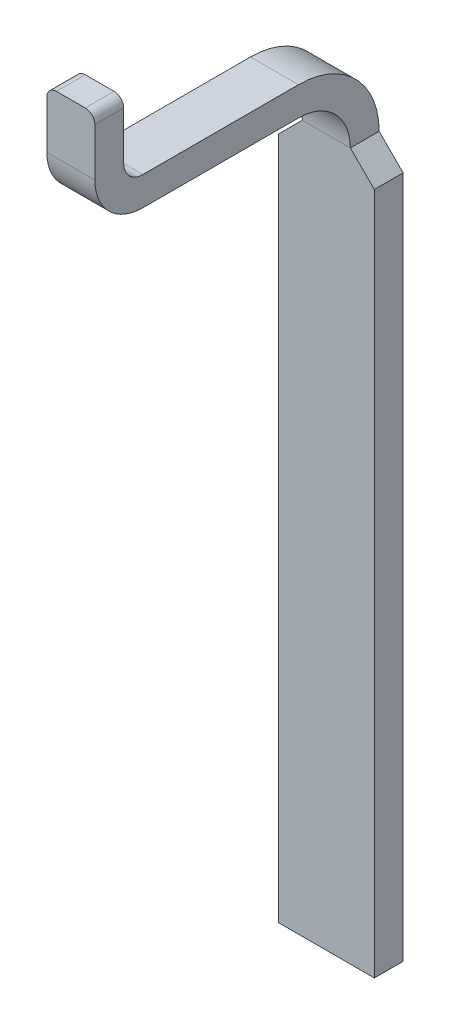
ISO-10303-21;
HEADER;
FILE_DESCRIPTION(('STEP AP214'),'2;1');
FILE_NAME('part.step','',(''),(''),'','','');
FILE_SCHEMA(('AUTOMOTIVE_DESIGN { 1 0 10303 214 1 1 1 1 }'));
ENDSEC;
DATA;
#1=APPLICATION_CONTEXT('core data for automotive mechanical design processes');
#2=APPLICATION_PROTOCOL_DEFINITION('international standard','automotive_design',2000,#1);
#3=PRODUCT_CONTEXT('',#1,'mechanical');
#4=PRODUCT('Part','Part','',(#3));
#5=PRODUCT_RELATED_PRODUCT_CATEGORY('part','',(#4));
#6=PRODUCT_DEFINITION_FORMATION('','',#4);
#7=PRODUCT_DEFINITION_CONTEXT('part definition',#1,'design');
#8=PRODUCT_DEFINITION('design','',#6,#7);
#9=PRODUCT_DEFINITION_SHAPE('','',#8);
#10=(LENGTH_UNIT() NAMED_UNIT(*) SI_UNIT(.MILLI.,.METRE.));
#11=(NAMED_UNIT(*) PLANE_ANGLE_UNIT() SI_UNIT($,.RADIAN.));
#12=(NAMED_UNIT(*) SI_UNIT($,.STERADIAN.) SOLID_ANGLE_UNIT());
#13=UNCERTAINTY_MEASURE_WITH_UNIT(LENGTH_MEASURE(1.E-05),#10,'distance_accuracy_value','');
#14=(GEOMETRIC_REPRESENTATION_CONTEXT(3) GLOBAL_UNCERTAINTY_ASSIGNED_CONTEXT((#13)) GLOBAL_UNIT_ASSIGNED_CONTEXT((#10,
#11,#12)) REPRESENTATION_CONTEXT('',''));
#15=CARTESIAN_POINT('',(0.,0.,0.));
#16=DIRECTION('',(0.,0.,1.));
#17=DIRECTION('',(1.,0.,0.));
#18=AXIS2_PLACEMENT_3D('',#15,#16,#17);
#19=CARTESIAN_POINT('',(0.075,2.61,1.405));
#20=DIRECTION('',(0.,0.,1.));
#21=DIRECTION('',(-1.,0.,0.));
#22=AXIS2_PLACEMENT_3D('',#19,#20,#21);
#23=CYLINDRICAL_SURFACE('',#22,0.05);
#24=CARTESIAN_POINT('',(0.075,2.61,1.405));
#25=DIRECTION('',(0.,0.,1.));
#26=DIRECTION('',(1.,0.,0.));
#27=AXIS2_PLACEMENT_3D('',#24,#25,#26);
#28=CIRCLE('',#27,0.05);
#29=CARTESIAN_POINT('',(0.125,2.61,1.405));
#30=VERTEX_POINT('',#29);
#31=CARTESIAN_POINT('',(0.075,2.66,1.405));
#32=VERTEX_POINT('',#31);
#33=EDGE_CURVE('E11',#30,#32,#28,.T.);
#34=ORIENTED_EDGE('',*,*,#33,.F.);
#35=DIRECTION('',(0.,0.,-1.));
#36=VECTOR('',#35,1.);
#37=CARTESIAN_POINT('',(0.125,2.61,0.345));
#38=LINE('',#37,#36);
#39=CARTESIAN_POINT('',(0.125,2.61,1.255));
#40=VERTEX_POINT('',#39);
#41=EDGE_CURVE('E23',#30,#40,#38,.T.);
#42=ORIENTED_EDGE('',*,*,#41,.T.);
#43=CARTESIAN_POINT('',(0.075,2.61,1.255));
#44=DIRECTION('',(0.,0.,-1.));
#45=DIRECTION('',(0.,1.,0.));
#46=AXIS2_PLACEMENT_3D('',#43,#44,#45);
#47=CIRCLE('',#46,0.05);
#48=CARTESIAN_POINT('',(0.075,2.66,1.255));
#49=VERTEX_POINT('',#48);
#50=EDGE_CURVE('E248',#49,#40,#47,.T.);
#51=ORIENTED_EDGE('',*,*,#50,.F.);
#52=DIRECTION('',(0.,0.,-1.));
#53=VECTOR('',#52,1.);
#54=CARTESIAN_POINT('',(0.075,2.66,1.405));
#55=LINE('',#54,#53);
#56=EDGE_CURVE('E245',#32,#49,#55,.T.);
#57=ORIENTED_EDGE('',*,*,#56,.F.);
#58=EDGE_LOOP('',(#34,#42,#51,#57));
#59=FACE_BOUND('',#58,.T.);
#60=ADVANCED_FACE('F16',(#59),#23,.T.);
#61=CARTESIAN_POINT('',(-0.075,2.61,0.345));
#62=DIRECTION('',(0.,0.,-1.));
#63=DIRECTION('',(1.,0.,0.));
#64=AXIS2_PLACEMENT_3D('',#61,#62,#63);
#65=CYLINDRICAL_SURFACE('',#64,0.05);
#66=CARTESIAN_POINT('',(-0.075,2.61,1.405));
#67=DIRECTION('',(0.,0.,1.));
#68=DIRECTION('',(1.,0.,0.));
#69=AXIS2_PLACEMENT_3D('',#66,#67,#68);
#70=CIRCLE('',#69,0.05);
#71=CARTESIAN_POINT('',(-0.075,2.66,1.405));
#72=VERTEX_POINT('',#71);
#73=CARTESIAN_POINT('',(-0.125,2.61,1.405));
#74=VERTEX_POINT('',#73);
#75=EDGE_CURVE('E243',#72,#74,#70,.T.);
#76=ORIENTED_EDGE('',*,*,#75,.F.);
#77=DIRECTION('',(0.,0.,-1.));
#78=VECTOR('',#77,1.);
#79=CARTESIAN_POINT('',(-0.075,2.66,1.405));
#80=LINE('',#79,#78);
#81=CARTESIAN_POINT('',(-0.075,2.66,1.255));
#82=VERTEX_POINT('',#81);
#83=EDGE_CURVE('E241',#72,#82,#80,.T.);
#84=ORIENTED_EDGE('',*,*,#83,.T.);
#85=CARTESIAN_POINT('',(-0.075,2.61,1.255));
#86=DIRECTION('',(0.,0.,-1.));
#87=DIRECTION('',(0.,1.,0.));
#88=AXIS2_PLACEMENT_3D('',#85,#86,#87);
#89=CIRCLE('',#88,0.05);
#90=CARTESIAN_POINT('',(-0.125,2.61,1.255));
#91=VERTEX_POINT('',#90);
#92=EDGE_CURVE('E238',#91,#82,#89,.T.);
#93=ORIENTED_EDGE('',*,*,#92,.F.);
#94=DIRECTION('',(0.,0.,-1.));
#95=VECTOR('',#94,1.);
#96=CARTESIAN_POINT('',(-0.125,2.61,1.255));
#97=LINE('',#96,#95);
#98=EDGE_CURVE('E235',#74,#91,#97,.T.);
#99=ORIENTED_EDGE('',*,*,#98,.F.);
#100=EDGE_LOOP('',(#76,#84,#93,#99));
#101=FACE_BOUND('',#100,.T.);
#102=ADVANCED_FACE('F275',(#101),#65,.T.);
#103=CARTESIAN_POINT('',(0.25,-1.84,0.075));
#104=DIRECTION('',(0.,1.,0.));
#105=DIRECTION('',(0.,0.,1.));
#106=AXIS2_PLACEMENT_3D('',#103,#104,#105);
#107=PLANE('',#106);
#108=DIRECTION('',(0.,0.,-1.));
#109=VECTOR('',#108,1.);
#110=CARTESIAN_POINT('',(-0.25,-1.84,0.075));
#111=LINE('',#110,#109);
#112=CARTESIAN_POINT('',(-0.25,-1.84,0.075));
#113=VERTEX_POINT('',#112);
#114=CARTESIAN_POINT('',(-0.25,-1.84,-0.075));
#115=VERTEX_POINT('',#114);
#116=EDGE_CURVE('E233',#113,#115,#111,.T.);
#117=ORIENTED_EDGE('',*,*,#116,.T.);
#118=DIRECTION('',(-1.,0.,0.));
#119=VECTOR('',#118,1.);
#120=CARTESIAN_POINT('',(0.25,-1.84,-0.075));
#121=LINE('',#120,#119);
#122=CARTESIAN_POINT('',(0.25,-1.84,-0.075));
#123=VERTEX_POINT('',#122);
#124=EDGE_CURVE('E230',#123,#115,#121,.T.);
#125=ORIENTED_EDGE('',*,*,#124,.F.);
#126=DIRECTION('',(0.,0.,-1.));
#127=VECTOR('',#126,1.);
#128=CARTESIAN_POINT('',(0.25,-1.84,0.075));
#129=LINE('',#128,#127);
#130=CARTESIAN_POINT('',(0.25,-1.84,0.075));
#131=VERTEX_POINT('',#130);
#132=EDGE_CURVE('E227',#131,#123,#129,.T.);
#133=ORIENTED_EDGE('',*,*,#132,.F.);
#134=DIRECTION('',(-1.,0.,0.));
#135=VECTOR('',#134,1.);
#136=CARTESIAN_POINT('',(0.25,-1.84,0.075));
#137=LINE('',#136,#135);
#138=EDGE_CURVE('E224',#131,#113,#137,.T.);
#139=ORIENTED_EDGE('',*,*,#138,.T.);
#140=EDGE_LOOP('',(#117,#125,#133,#139));
#141=FACE_BOUND('',#140,.T.);
#142=ADVANCED_FACE('F316',(#141),#107,.F.);
#143=CARTESIAN_POINT('',(0.25,-1.84,-0.075));
#144=DIRECTION('',(0.,0.,1.));
#145=DIRECTION('',(0.,-1.,0.));
#146=AXIS2_PLACEMENT_3D('',#143,#144,#145);
#147=PLANE('',#146);
#148=DIRECTION('',(0.,1.,0.));
#149=VECTOR('',#148,1.);
#150=CARTESIAN_POINT('',(-0.25,-1.84,-0.075));
#151=LINE('',#150,#149);
#152=CARTESIAN_POINT('',(-0.25,1.715,-0.075));
#153=VERTEX_POINT('',#152);
#154=EDGE_CURVE('E222',#115,#153,#151,.T.);
#155=ORIENTED_EDGE('',*,*,#154,.T.);
#156=DIRECTION('',(-0.707106781186547,-0.707106781186548,0.));
#157=VECTOR('',#156,1.);
#158=CARTESIAN_POINT('',(-0.125,1.84,-0.075));
#159=LINE('',#158,#157);
#160=CARTESIAN_POINT('',(-0.125,1.84,-0.075));
#161=VERTEX_POINT('',#160);
#162=EDGE_CURVE('E219',#161,#153,#159,.T.);
#163=ORIENTED_EDGE('',*,*,#162,.F.);
#164=DIRECTION('',(-1.,0.,0.));
#165=VECTOR('',#164,1.);
#166=CARTESIAN_POINT('',(0.25,1.84,-0.075));
#167=LINE('',#166,#165);
#168=CARTESIAN_POINT('',(0.125,1.84,-0.0749999999999992));
#169=VERTEX_POINT('',#168);
#170=EDGE_CURVE('E217',#169,#161,#167,.T.);
#171=ORIENTED_EDGE('',*,*,#170,.F.);
#172=DIRECTION('',(0.707106781186547,-0.707106781186548,0.));
#173=VECTOR('',#172,1.);
#174=CARTESIAN_POINT('',(0.25,1.715,-0.075));
#175=LINE('',#174,#173);
#176=CARTESIAN_POINT('',(0.25,1.715,-0.075));
#177=VERTEX_POINT('',#176);
#178=EDGE_CURVE('E215',#169,#177,#175,.T.);
#179=ORIENTED_EDGE('',*,*,#178,.T.);
#180=DIRECTION('',(0.,1.,0.));
#181=VECTOR('',#180,1.);
#182=CARTESIAN_POINT('',(0.25,-1.84,-0.075));
#183=LINE('',#182,#181);
#184=EDGE_CURVE('E212',#123,#177,#183,.T.);
#185=ORIENTED_EDGE('',*,*,#184,.F.);
#186=ORIENTED_EDGE('',*,*,#124,.T.);
#187=EDGE_LOOP('',(#155,#163,#171,#179,#185,#186));
#188=FACE_BOUND('',#187,.T.);
#189=ADVANCED_FACE('F308',(#188),#147,.F.);
#190=CARTESIAN_POINT('',(-0.125,1.84,-0.075));
#191=DIRECTION('',(0.707106781186548,-0.707106781186547,0.));
#192=DIRECTION('',(0.707106781186547,0.707106781186548,0.));
#193=AXIS2_PLACEMENT_3D('',#190,#191,#192);
#194=PLANE('',#193);
#195=ORIENTED_EDGE('',*,*,#162,.T.);
#196=DIRECTION('',(0.,0.,-1.));
#197=VECTOR('',#196,1.);
#198=CARTESIAN_POINT('',(-0.25,1.715,-0.075));
#199=LINE('',#198,#197);
#200=CARTESIAN_POINT('',(-0.25,1.715,0.075000000000001));
#201=VERTEX_POINT('',#200);
#202=EDGE_CURVE('E209',#201,#153,#199,.T.);
#203=ORIENTED_EDGE('',*,*,#202,.F.);
#204=DIRECTION('',(0.707106781186547,0.707106781186548,0.));
#205=VECTOR('',#204,1.);
#206=CARTESIAN_POINT('',(-0.125,1.84,0.075000000000001));
#207=LINE('',#206,#205);
#208=CARTESIAN_POINT('',(-0.125,1.84,0.075000000000001));
#209=VERTEX_POINT('',#208);
#210=EDGE_CURVE('E207',#201,#209,#207,.T.);
#211=ORIENTED_EDGE('',*,*,#210,.T.);
#212=DIRECTION('',(0.,0.,1.));
#213=VECTOR('',#212,1.);
#214=CARTESIAN_POINT('',(-0.125,1.84,-0.075));
#215=LINE('',#214,#213);
#216=EDGE_CURVE('E204',#161,#209,#215,.T.);
#217=ORIENTED_EDGE('',*,*,#216,.F.);
#218=EDGE_LOOP('',(#195,#203,#211,#217));
#219=FACE_BOUND('',#218,.T.);
#220=ADVANCED_FACE('F312',(#219),#194,.F.);
#221=CARTESIAN_POINT('',(0.25,1.715,-0.075));
#222=DIRECTION('',(0.707106781186548,0.707106781186547,0.));
#223=DIRECTION('',(-0.707106781186547,0.707106781186548,0.));
#224=AXIS2_PLACEMENT_3D('',#221,#222,#223);
#225=PLANE('',#224);
#226=ORIENTED_EDGE('',*,*,#178,.F.);
#227=DIRECTION('',(0.,0.,-1.));
#228=VECTOR('',#227,1.);
#229=CARTESIAN_POINT('',(0.125,1.84,-0.075));
#230=LINE('',#229,#228);
#231=CARTESIAN_POINT('',(0.125,1.84,0.075000000000001));
#232=VERTEX_POINT('',#231);
#233=EDGE_CURVE('E149',#232,#169,#230,.T.);
#234=ORIENTED_EDGE('',*,*,#233,.F.);
#235=DIRECTION('',(-0.707106781186547,0.707106781186548,0.));
#236=VECTOR('',#235,1.);
#237=CARTESIAN_POINT('',(0.25,1.715,0.075000000000001));
#238=LINE('',#237,#236);
#239=CARTESIAN_POINT('',(0.25,1.715,0.075000000000001));
#240=VERTEX_POINT('',#239);
#241=EDGE_CURVE('E200',#240,#232,#238,.T.);
#242=ORIENTED_EDGE('',*,*,#241,.F.);
#243=DIRECTION('',(0.,0.,1.));
#244=VECTOR('',#243,1.);
#245=CARTESIAN_POINT('',(0.25,1.715,0.075000000000001));
#246=LINE('',#245,#244);
#247=EDGE_CURVE('E197',#177,#240,#246,.T.);
#248=ORIENTED_EDGE('',*,*,#247,.F.);
#249=EDGE_LOOP('',(#226,#234,#242,#248));
#250=FACE_BOUND('',#249,.T.);
#251=ADVANCED_FACE('F303',(#250),#225,.T.);
#252=CARTESIAN_POINT('',(0.125,1.84,0.345));
#253=DIRECTION('',(1.,0.,0.));
#254=DIRECTION('',(0.,0.,1.));
#255=AXIS2_PLACEMENT_3D('',#252,#253,#254);
#256=CYLINDRICAL_SURFACE('',#255,0.27);
#257=CARTESIAN_POINT('',(-0.125,1.84,0.345));
#258=DIRECTION('',(1.,0.,0.));
#259=DIRECTION('',(0.,-1.,0.));
#260=AXIS2_PLACEMENT_3D('',#257,#258,#259);
#261=CIRCLE('',#260,0.27);
#262=CARTESIAN_POINT('',(-0.125,2.11,0.345));
#263=VERTEX_POINT('',#262);
#264=EDGE_CURVE('E194',#209,#263,#261,.T.);
#265=ORIENTED_EDGE('',*,*,#264,.F.);
#266=DIRECTION('',(-1.,0.,0.));
#267=VECTOR('',#266,1.);
#268=CARTESIAN_POINT('',(0.25,1.84,0.075000000000001));
#269=LINE('',#268,#267);
#270=EDGE_CURVE('E191',#232,#209,#269,.T.);
#271=ORIENTED_EDGE('',*,*,#270,.F.);
#272=CARTESIAN_POINT('',(0.125,1.84,0.345));
#273=DIRECTION('',(1.,0.,0.));
#274=DIRECTION('',(0.,-1.,0.));
#275=AXIS2_PLACEMENT_3D('',#272,#273,#274);
#276=CIRCLE('',#275,0.27);
#277=CARTESIAN_POINT('',(0.125,2.11,0.345));
#278=VERTEX_POINT('',#277);
#279=EDGE_CURVE('E188',#232,#278,#276,.T.);
#280=ORIENTED_EDGE('',*,*,#279,.T.);
#281=DIRECTION('',(-1.,0.,0.));
#282=VECTOR('',#281,1.);
#283=CARTESIAN_POINT('',(0.125,2.11,0.345));
#284=LINE('',#283,#282);
#285=EDGE_CURVE('E186',#278,#263,#284,.T.);
#286=ORIENTED_EDGE('',*,*,#285,.T.);
#287=EDGE_LOOP('',(#265,#271,#280,#286));
#288=FACE_BOUND('',#287,.T.);
#289=ADVANCED_FACE('F293',(#288),#256,.F.);
#290=CARTESIAN_POINT('',(-0.25,-1.84,-0.075));
#291=DIRECTION('',(1.,0.,0.));
#292=DIRECTION('',(0.,1.,0.));
#293=AXIS2_PLACEMENT_3D('',#290,#291,#292);
#294=PLANE('',#293);
#295=DIRECTION('',(0.,-1.,0.));
#296=VECTOR('',#295,1.);
#297=CARTESIAN_POINT('',(-0.25,1.84,0.075000000000001));
#298=LINE('',#297,#296);
#299=EDGE_CURVE('E183',#201,#113,#298,.T.);
#300=ORIENTED_EDGE('',*,*,#299,.F.);
#301=ORIENTED_EDGE('',*,*,#202,.T.);
#302=ORIENTED_EDGE('',*,*,#154,.F.);
#303=ORIENTED_EDGE('',*,*,#116,.F.);
#304=EDGE_LOOP('',(#300,#301,#302,#303));
#305=FACE_BOUND('',#304,.T.);
#306=ADVANCED_FACE('F314',(#305),#294,.F.);
#307=CARTESIAN_POINT('',(0.25,-1.84,-0.075));
#308=DIRECTION('',(1.,0.,0.));
#309=DIRECTION('',(0.,1.,0.));
#310=AXIS2_PLACEMENT_3D('',#307,#308,#309);
#311=PLANE('',#310);
#312=ORIENTED_EDGE('',*,*,#184,.T.);
#313=ORIENTED_EDGE('',*,*,#247,.T.);
#314=DIRECTION('',(0.,-1.,0.));
#315=VECTOR('',#314,1.);
#316=CARTESIAN_POINT('',(0.25,1.84,0.075000000000001));
#317=LINE('',#316,#315);
#318=EDGE_CURVE('E180',#240,#131,#317,.T.);
#319=ORIENTED_EDGE('',*,*,#318,.T.);
#320=ORIENTED_EDGE('',*,*,#132,.T.);
#321=EDGE_LOOP('',(#312,#313,#319,#320));
#322=FACE_BOUND('',#321,.T.);
#323=ADVANCED_FACE('F305',(#322),#311,.T.);
#324=CARTESIAN_POINT('',(0.25,1.84,0.075000000000001));
#325=DIRECTION('',(0.,0.,-1.));
#326=DIRECTION('',(0.,1.,0.));
#327=AXIS2_PLACEMENT_3D('',#324,#325,#326);
#328=PLANE('',#327);
#329=ORIENTED_EDGE('',*,*,#270,.T.);
#330=ORIENTED_EDGE('',*,*,#210,.F.);
#331=ORIENTED_EDGE('',*,*,#299,.T.);
#332=ORIENTED_EDGE('',*,*,#138,.F.);
#333=ORIENTED_EDGE('',*,*,#318,.F.);
#334=ORIENTED_EDGE('',*,*,#241,.T.);
#335=EDGE_LOOP('',(#329,#330,#331,#332,#333,#334));
#336=FACE_BOUND('',#335,.T.);
#337=ADVANCED_FACE('F296',(#336),#328,.F.);
#338=CARTESIAN_POINT('',(0.125,2.11,0.345));
#339=DIRECTION('',(0.,-1.,0.));
#340=DIRECTION('',(0.,0.,-1.));
#341=AXIS2_PLACEMENT_3D('',#338,#339,#340);
#342=PLANE('',#341);
#343=DIRECTION('',(0.,0.,1.));
#344=VECTOR('',#343,1.);
#345=CARTESIAN_POINT('',(-0.125,2.11,0.345));
#346=LINE('',#345,#344);
#347=CARTESIAN_POINT('',(-0.125,2.11,1.155));
#348=VERTEX_POINT('',#347);
#349=EDGE_CURVE('E178',#263,#348,#346,.T.);
#350=ORIENTED_EDGE('',*,*,#349,.F.);
#351=ORIENTED_EDGE('',*,*,#285,.F.);
#352=DIRECTION('',(0.,0.,1.));
#353=VECTOR('',#352,1.);
#354=CARTESIAN_POINT('',(0.125,2.11,0.345));
#355=LINE('',#354,#353);
#356=CARTESIAN_POINT('',(0.125,2.11,1.155));
#357=VERTEX_POINT('',#356);
#358=EDGE_CURVE('E176',#278,#357,#355,.T.);
#359=ORIENTED_EDGE('',*,*,#358,.T.);
#360=DIRECTION('',(-1.,0.,0.));
#361=VECTOR('',#360,1.);
#362=CARTESIAN_POINT('',(0.125,2.11,1.155));
#363=LINE('',#362,#361);
#364=EDGE_CURVE('E173',#357,#348,#363,.T.);
#365=ORIENTED_EDGE('',*,*,#364,.T.);
#366=EDGE_LOOP('',(#350,#351,#359,#365));
#367=FACE_BOUND('',#366,.T.);
#368=ADVANCED_FACE('F289',(#367),#342,.T.);
#369=CARTESIAN_POINT('',(0.125,2.36,1.155));
#370=DIRECTION('',(1.,0.,0.));
#371=DIRECTION('',(0.,0.,1.));
#372=AXIS2_PLACEMENT_3D('',#369,#370,#371);
#373=CYLINDRICAL_SURFACE('',#372,0.25);
#374=CARTESIAN_POINT('',(-0.125,2.36,1.155));
#375=DIRECTION('',(-1.,0.,0.));
#376=DIRECTION('',(0.,1.,0.));
#377=AXIS2_PLACEMENT_3D('',#374,#375,#376);
#378=CIRCLE('',#377,0.25);
#379=CARTESIAN_POINT('',(-0.125,2.36,1.405));
#380=VERTEX_POINT('',#379);
#381=EDGE_CURVE('E171',#348,#380,#378,.T.);
#382=ORIENTED_EDGE('',*,*,#381,.F.);
#383=ORIENTED_EDGE('',*,*,#364,.F.);
#384=CARTESIAN_POINT('',(0.125,2.36,1.155));
#385=DIRECTION('',(-1.,0.,0.));
#386=DIRECTION('',(0.,1.,0.));
#387=AXIS2_PLACEMENT_3D('',#384,#385,#386);
#388=CIRCLE('',#387,0.25);
#389=CARTESIAN_POINT('',(0.125,2.36,1.405));
#390=VERTEX_POINT('',#389);
#391=EDGE_CURVE('E169',#357,#390,#388,.T.);
#392=ORIENTED_EDGE('',*,*,#391,.T.);
#393=DIRECTION('',(-1.,0.,0.));
#394=VECTOR('',#393,1.);
#395=CARTESIAN_POINT('',(0.125,2.36,1.405));
#396=LINE('',#395,#394);
#397=EDGE_CURVE('E166',#390,#380,#396,.T.);
#398=ORIENTED_EDGE('',*,*,#397,.T.);
#399=EDGE_LOOP('',(#382,#383,#392,#398));
#400=FACE_BOUND('',#399,.T.);
#401=ADVANCED_FACE('F286',(#400),#373,.T.);
#402=CARTESIAN_POINT('',(0.125,2.36,1.155));
#403=DIRECTION('',(1.,0.,0.));
#404=DIRECTION('',(0.,0.,1.));
#405=AXIS2_PLACEMENT_3D('',#402,#403,#404);
#406=CYLINDRICAL_SURFACE('',#405,0.1);
#407=CARTESIAN_POINT('',(-0.125,2.36,1.155));
#408=DIRECTION('',(1.,0.,0.));
#409=DIRECTION('',(0.,1.,0.));
#410=AXIS2_PLACEMENT_3D('',#407,#408,#409);
#411=CIRCLE('',#410,0.1);
#412=CARTESIAN_POINT('',(-0.125,2.36,1.255));
#413=VERTEX_POINT('',#412);
#414=CARTESIAN_POINT('',(-0.125,2.26,1.155));
#415=VERTEX_POINT('',#414);
#416=EDGE_CURVE('E163',#413,#415,#411,.T.);
#417=ORIENTED_EDGE('',*,*,#416,.F.);
#418=DIRECTION('',(-1.,0.,0.));
#419=VECTOR('',#418,1.);
#420=CARTESIAN_POINT('',(0.125,2.36,1.255));
#421=LINE('',#420,#419);
#422=CARTESIAN_POINT('',(0.125,2.36,1.255));
#423=VERTEX_POINT('',#422);
#424=EDGE_CURVE('E161',#423,#413,#421,.T.);
#425=ORIENTED_EDGE('',*,*,#424,.F.);
#426=CARTESIAN_POINT('',(0.125,2.36,1.155));
#427=DIRECTION('',(1.,0.,0.));
#428=DIRECTION('',(0.,1.,0.));
#429=AXIS2_PLACEMENT_3D('',#426,#427,#428);
#430=CIRCLE('',#429,0.1);
#431=CARTESIAN_POINT('',(0.125,2.26,1.155));
#432=VERTEX_POINT('',#431);
#433=EDGE_CURVE('E159',#423,#432,#430,.T.);
#434=ORIENTED_EDGE('',*,*,#433,.T.);
#435=DIRECTION('',(-1.,0.,0.));
#436=VECTOR('',#435,1.);
#437=CARTESIAN_POINT('',(0.125,2.26,1.155));
#438=LINE('',#437,#436);
#439=EDGE_CURVE('E131',#432,#415,#438,.T.);
#440=ORIENTED_EDGE('',*,*,#439,.T.);
#441=EDGE_LOOP('',(#417,#425,#434,#440));
#442=FACE_BOUND('',#441,.T.);
#443=ADVANCED_FACE('F425',(#442),#406,.F.);
#444=CARTESIAN_POINT('',(0.125,2.26,0.345));
#445=DIRECTION('',(0.,1.,0.));
#446=DIRECTION('',(0.,0.,1.));
#447=AXIS2_PLACEMENT_3D('',#444,#445,#446);
#448=PLANE('',#447);
#449=DIRECTION('',(0.,0.,-1.));
#450=VECTOR('',#449,1.);
#451=CARTESIAN_POINT('',(-0.125,2.26,0.345));
#452=LINE('',#451,#450);
#453=CARTESIAN_POINT('',(-0.125,2.26,0.345));
#454=VERTEX_POINT('',#453);
#455=EDGE_CURVE('E135',#415,#454,#452,.T.);
#456=ORIENTED_EDGE('',*,*,#455,.F.);
#457=ORIENTED_EDGE('',*,*,#439,.F.);
#458=DIRECTION('',(0.,0.,-1.));
#459=VECTOR('',#458,1.);
#460=CARTESIAN_POINT('',(0.125,2.26,0.345));
#461=LINE('',#460,#459);
#462=CARTESIAN_POINT('',(0.125,2.26,0.345));
#463=VERTEX_POINT('',#462);
#464=EDGE_CURVE('E125',#432,#463,#461,.T.);
#465=ORIENTED_EDGE('',*,*,#464,.T.);
#466=DIRECTION('',(-1.,0.,0.));
#467=VECTOR('',#466,1.);
#468=CARTESIAN_POINT('',(0.125,2.26,0.345));
#469=LINE('',#468,#467);
#470=EDGE_CURVE('E129',#463,#454,#469,.T.);
#471=ORIENTED_EDGE('',*,*,#470,.T.);
#472=EDGE_LOOP('',(#456,#457,#465,#471));
#473=FACE_BOUND('',#472,.T.);
#474=ADVANCED_FACE('F128',(#473),#448,.T.);
#475=CARTESIAN_POINT('',(0.125,1.84,0.345));
#476=DIRECTION('',(1.,0.,0.));
#477=DIRECTION('',(0.,0.,1.));
#478=AXIS2_PLACEMENT_3D('',#475,#476,#477);
#479=CYLINDRICAL_SURFACE('',#478,0.42);
#480=CARTESIAN_POINT('',(-0.125,1.84,0.345));
#481=DIRECTION('',(-1.,0.,0.));
#482=DIRECTION('',(0.,-1.,0.));
#483=AXIS2_PLACEMENT_3D('',#480,#481,#482);
#484=CIRCLE('',#483,0.42);
#485=EDGE_CURVE('E143',#454,#161,#484,.T.);
#486=ORIENTED_EDGE('',*,*,#485,.F.);
#487=ORIENTED_EDGE('',*,*,#470,.F.);
#488=CARTESIAN_POINT('',(0.125,1.84,0.345));
#489=DIRECTION('',(-1.,0.,0.));
#490=DIRECTION('',(0.,-1.,0.));
#491=AXIS2_PLACEMENT_3D('',#488,#489,#490);
#492=CIRCLE('',#491,0.42);
#493=EDGE_CURVE('E141',#463,#169,#492,.T.);
#494=ORIENTED_EDGE('',*,*,#493,.T.);
#495=ORIENTED_EDGE('',*,*,#170,.T.);
#496=EDGE_LOOP('',(#486,#487,#494,#495));
#497=FACE_BOUND('',#496,.T.);
#498=ADVANCED_FACE('F139',(#497),#479,.T.);
#499=CARTESIAN_POINT('',(0.125,2.36,1.405));
#500=DIRECTION('',(0.,0.,1.));
#501=DIRECTION('',(1.,0.,0.));
#502=AXIS2_PLACEMENT_3D('',#499,#500,#501);
#503=PLANE('',#502);
#504=DIRECTION('',(0.,1.,0.));
#505=VECTOR('',#504,1.);
#506=CARTESIAN_POINT('',(0.125,2.36,1.405));
#507=LINE('',#506,#505);
#508=EDGE_CURVE('E150',#390,#30,#507,.T.);
#509=ORIENTED_EDGE('',*,*,#508,.T.);
#510=ORIENTED_EDGE('',*,*,#33,.T.);
#511=DIRECTION('',(-1.,0.,0.));
#512=VECTOR('',#511,1.);
#513=CARTESIAN_POINT('',(0.125,2.66,1.405));
#514=LINE('',#513,#512);
#515=EDGE_CURVE('E153',#32,#72,#514,.T.);
#516=ORIENTED_EDGE('',*,*,#515,.T.);
#517=ORIENTED_EDGE('',*,*,#75,.T.);
#518=DIRECTION('',(0.,1.,0.));
#519=VECTOR('',#518,1.);
#520=CARTESIAN_POINT('',(-0.125,2.36,1.405));
#521=LINE('',#520,#519);
#522=EDGE_CURVE('E261',#380,#74,#521,.T.);
#523=ORIENTED_EDGE('',*,*,#522,.F.);
#524=ORIENTED_EDGE('',*,*,#397,.F.);
#525=EDGE_LOOP('',(#509,#510,#516,#517,#523,#524));
#526=FACE_BOUND('',#525,.T.);
#527=ADVANCED_FACE('F268',(#526),#503,.T.);
#528=CARTESIAN_POINT('',(0.125,2.66,1.405));
#529=DIRECTION('',(0.,1.,0.));
#530=DIRECTION('',(0.,0.,1.));
#531=AXIS2_PLACEMENT_3D('',#528,#529,#530);
#532=PLANE('',#531);
#533=ORIENTED_EDGE('',*,*,#515,.F.);
#534=ORIENTED_EDGE('',*,*,#56,.T.);
#535=DIRECTION('',(-1.,0.,0.));
#536=VECTOR('',#535,1.);
#537=CARTESIAN_POINT('',(0.125,2.66,1.255));
#538=LINE('',#537,#536);
#539=EDGE_CURVE('E257',#49,#82,#538,.T.);
#540=ORIENTED_EDGE('',*,*,#539,.T.);
#541=ORIENTED_EDGE('',*,*,#83,.F.);
#542=EDGE_LOOP('',(#533,#534,#540,#541));
#543=FACE_BOUND('',#542,.T.);
#544=ADVANCED_FACE('F273',(#543),#532,.T.);
#545=CARTESIAN_POINT('',(0.125,2.36,1.255));
#546=DIRECTION('',(0.,0.,-1.));
#547=DIRECTION('',(0.,1.,0.));
#548=AXIS2_PLACEMENT_3D('',#545,#546,#547);
#549=PLANE('',#548);
#550=ORIENTED_EDGE('',*,*,#539,.F.);
#551=ORIENTED_EDGE('',*,*,#50,.T.);
#552=DIRECTION('',(0.,-1.,0.));
#553=VECTOR('',#552,1.);
#554=CARTESIAN_POINT('',(0.125,2.36,1.255));
#555=LINE('',#554,#553);
#556=EDGE_CURVE('E255',#40,#423,#555,.T.);
#557=ORIENTED_EDGE('',*,*,#556,.T.);
#558=ORIENTED_EDGE('',*,*,#424,.T.);
#559=DIRECTION('',(0.,-1.,0.));
#560=VECTOR('',#559,1.);
#561=CARTESIAN_POINT('',(-0.125,2.36,1.255));
#562=LINE('',#561,#560);
#563=EDGE_CURVE('E259',#91,#413,#562,.T.);
#564=ORIENTED_EDGE('',*,*,#563,.F.);
#565=ORIENTED_EDGE('',*,*,#92,.T.);
#566=EDGE_LOOP('',(#550,#551,#557,#558,#564,#565));
#567=FACE_BOUND('',#566,.T.);
#568=ADVANCED_FACE('F254',(#567),#549,.T.);
#569=CARTESIAN_POINT('',(0.125,1.84,0.345));
#570=DIRECTION('',(1.,0.,0.));
#571=DIRECTION('',(0.,1.,0.));
#572=AXIS2_PLACEMENT_3D('',#569,#570,#571);
#573=PLANE('',#572);
#574=ORIENTED_EDGE('',*,*,#556,.F.);
#575=ORIENTED_EDGE('',*,*,#41,.F.);
#576=ORIENTED_EDGE('',*,*,#508,.F.);
#577=ORIENTED_EDGE('',*,*,#391,.F.);
#578=ORIENTED_EDGE('',*,*,#358,.F.);
#579=ORIENTED_EDGE('',*,*,#279,.F.);
#580=ORIENTED_EDGE('',*,*,#233,.T.);
#581=ORIENTED_EDGE('',*,*,#493,.F.);
#582=ORIENTED_EDGE('',*,*,#464,.F.);
#583=ORIENTED_EDGE('',*,*,#433,.F.);
#584=EDGE_LOOP('',(#574,#575,#576,#577,#578,#579,#580,#581,#582,#583));
#585=FACE_BOUND('',#584,.T.);
#586=ADVANCED_FACE('F147',(#585),#573,.T.);
#587=CARTESIAN_POINT('',(-0.125,1.84,0.345));
#588=DIRECTION('',(1.,0.,0.));
#589=DIRECTION('',(0.,1.,0.));
#590=AXIS2_PLACEMENT_3D('',#587,#588,#589);
#591=PLANE('',#590);
#592=ORIENTED_EDGE('',*,*,#522,.T.);
#593=ORIENTED_EDGE('',*,*,#98,.T.);
#594=ORIENTED_EDGE('',*,*,#563,.T.);
#595=ORIENTED_EDGE('',*,*,#416,.T.);
#596=ORIENTED_EDGE('',*,*,#455,.T.);
#597=ORIENTED_EDGE('',*,*,#485,.T.);
#598=ORIENTED_EDGE('',*,*,#216,.T.);
#599=ORIENTED_EDGE('',*,*,#264,.T.);
#600=ORIENTED_EDGE('',*,*,#349,.T.);
#601=ORIENTED_EDGE('',*,*,#381,.T.);
#602=EDGE_LOOP('',(#592,#593,#594,#595,#596,#597,#598,#599,#600,#601));
#603=FACE_BOUND('',#602,.T.);
#604=ADVANCED_FACE('F279',(#603),#591,.F.);
#605=CLOSED_SHELL('',(#60,#102,#142,#189,#220,#251,#289,#306,#323,#337,#368,#401,#443,#474,#498,
#527,#544,#568,#586,#604));
#606=MANIFOLD_SOLID_BREP('B1',#605);
#607=ADVANCED_BREP_SHAPE_REPRESENTATION('',(#18,#606),#14);
#608=SHAPE_DEFINITION_REPRESENTATION(#9,#607);
ENDSEC;
END-ISO-10303-21;
